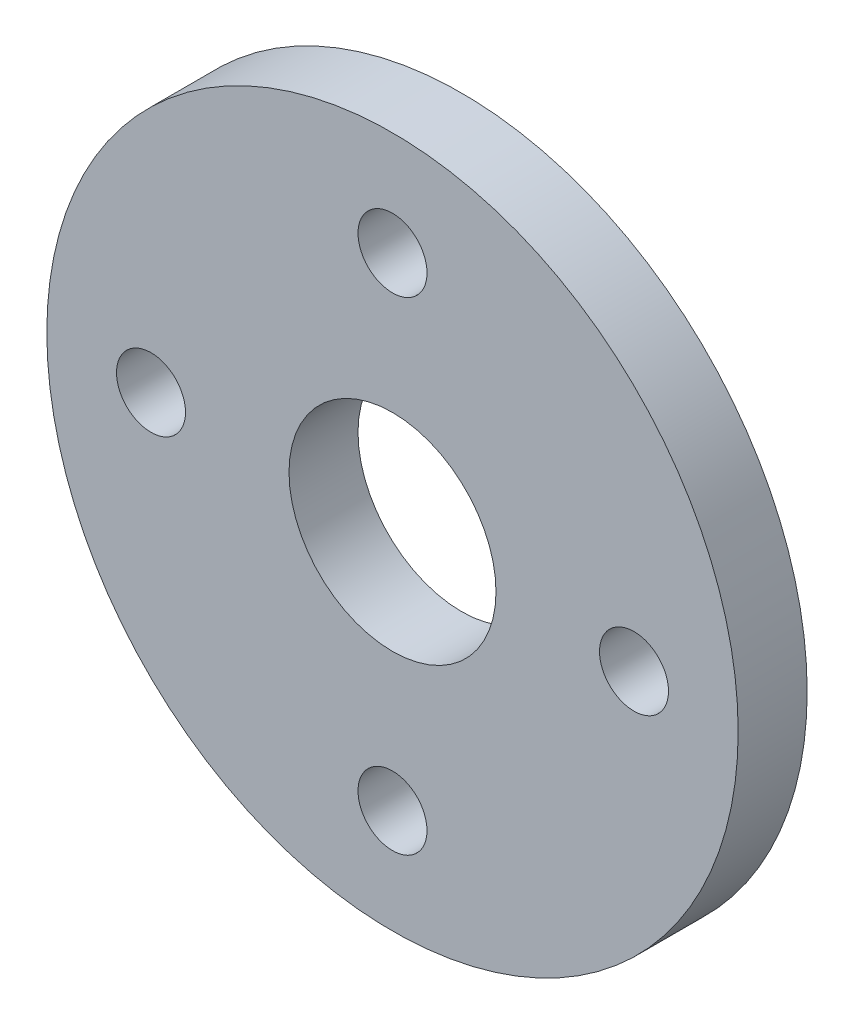
ISO-10303-21;
HEADER;
FILE_DESCRIPTION(('STEP AP214'),'2;1');
FILE_NAME('part.step','',(''),(''),'','','');
FILE_SCHEMA(('AUTOMOTIVE_DESIGN { 1 0 10303 214 1 1 1 1 }'));
ENDSEC;
DATA;
#1=APPLICATION_CONTEXT('core data for automotive mechanical design processes');
#2=APPLICATION_PROTOCOL_DEFINITION('international standard','automotive_design',2000,#1);
#3=PRODUCT_CONTEXT('',#1,'mechanical');
#4=PRODUCT('Part','Part','',(#3));
#5=PRODUCT_RELATED_PRODUCT_CATEGORY('part','',(#4));
#6=PRODUCT_DEFINITION_FORMATION('','',#4);
#7=PRODUCT_DEFINITION_CONTEXT('part definition',#1,'design');
#8=PRODUCT_DEFINITION('design','',#6,#7);
#9=PRODUCT_DEFINITION_SHAPE('','',#8);
#10=(LENGTH_UNIT() NAMED_UNIT(*) SI_UNIT(.MILLI.,.METRE.));
#11=(NAMED_UNIT(*) PLANE_ANGLE_UNIT() SI_UNIT($,.RADIAN.));
#12=(NAMED_UNIT(*) SI_UNIT($,.STERADIAN.) SOLID_ANGLE_UNIT());
#13=UNCERTAINTY_MEASURE_WITH_UNIT(LENGTH_MEASURE(1.E-05),#10,'distance_accuracy_value','');
#14=(GEOMETRIC_REPRESENTATION_CONTEXT(3) GLOBAL_UNCERTAINTY_ASSIGNED_CONTEXT((#13)) GLOBAL_UNIT_ASSIGNED_CONTEXT((#10,
#11,#12)) REPRESENTATION_CONTEXT('',''));
#15=CARTESIAN_POINT('',(0.,0.,0.));
#16=DIRECTION('',(0.,0.,1.));
#17=DIRECTION('',(1.,0.,0.));
#18=AXIS2_PLACEMENT_3D('',#15,#16,#17);
#19=CARTESIAN_POINT('',(0.,0.,2.));
#20=DIRECTION('',(0.,0.,1.));
#21=DIRECTION('',(1.,0.,0.));
#22=AXIS2_PLACEMENT_3D('',#19,#20,#21);
#23=PLANE('',#22);
#24=CARTESIAN_POINT('',(0.,-7.,2.));
#25=DIRECTION('',(0.,0.,1.));
#26=DIRECTION('',(1.,0.,0.));
#27=AXIS2_PLACEMENT_3D('',#24,#25,#26);
#28=CIRCLE('',#27,1.);
#29=CARTESIAN_POINT('',(0.999999999999951,-7.,2.));
#30=VERTEX_POINT('',#29);
#31=EDGE_CURVE('E65',#30,#30,#28,.T.);
#32=ORIENTED_EDGE('',*,*,#31,.F.);
#33=EDGE_LOOP('',(#32));
#34=FACE_BOUND('',#33,.T.);
#35=CARTESIAN_POINT('',(0.,7.,2.));
#36=DIRECTION('',(0.,0.,1.));
#37=DIRECTION('',(1.,0.,0.));
#38=AXIS2_PLACEMENT_3D('',#35,#36,#37);
#39=CIRCLE('',#38,1.);
#40=CARTESIAN_POINT('',(1.,7.,2.));
#41=VERTEX_POINT('',#40);
#42=EDGE_CURVE('E53',#41,#41,#39,.T.);
#43=ORIENTED_EDGE('',*,*,#42,.F.);
#44=EDGE_LOOP('',(#43));
#45=FACE_BOUND('',#44,.T.);
#46=CARTESIAN_POINT('',(0.,0.,2.));
#47=DIRECTION('',(0.,0.,1.));
#48=DIRECTION('',(1.,0.,0.));
#49=AXIS2_PLACEMENT_3D('',#46,#47,#48);
#50=CIRCLE('',#49,10.02);
#51=CARTESIAN_POINT('',(10.02,0.,2.));
#52=VERTEX_POINT('',#51);
#53=EDGE_CURVE('E10',#52,#52,#50,.T.);
#54=ORIENTED_EDGE('',*,*,#53,.T.);
#55=EDGE_LOOP('',(#54));
#56=FACE_BOUND('',#55,.T.);
#57=CARTESIAN_POINT('',(0.,0.,2.));
#58=DIRECTION('',(0.,0.,1.));
#59=DIRECTION('',(1.,0.,0.));
#60=AXIS2_PLACEMENT_3D('',#57,#58,#59);
#61=CIRCLE('',#60,3.);
#62=CARTESIAN_POINT('',(3.,0.,2.));
#63=VERTEX_POINT('',#62);
#64=EDGE_CURVE('E48',#63,#63,#61,.T.);
#65=ORIENTED_EDGE('',*,*,#64,.F.);
#66=EDGE_LOOP('',(#65));
#67=FACE_BOUND('',#66,.T.);
#68=CARTESIAN_POINT('',(7.,0.,2.));
#69=DIRECTION('',(0.,0.,1.));
#70=DIRECTION('',(1.,0.,0.));
#71=AXIS2_PLACEMENT_3D('',#68,#69,#70);
#72=CIRCLE('',#71,1.);
#73=CARTESIAN_POINT('',(8.,0.,2.));
#74=VERTEX_POINT('',#73);
#75=EDGE_CURVE('E59',#74,#74,#72,.T.);
#76=ORIENTED_EDGE('',*,*,#75,.F.);
#77=EDGE_LOOP('',(#76));
#78=FACE_BOUND('',#77,.T.);
#79=CARTESIAN_POINT('',(-7.,0.,2.));
#80=DIRECTION('',(0.,0.,1.));
#81=DIRECTION('',(1.,0.,0.));
#82=AXIS2_PLACEMENT_3D('',#79,#80,#81);
#83=CIRCLE('',#82,1.);
#84=CARTESIAN_POINT('',(-6.,0.,2.));
#85=VERTEX_POINT('',#84);
#86=EDGE_CURVE('E71',#85,#85,#83,.T.);
#87=ORIENTED_EDGE('',*,*,#86,.F.);
#88=EDGE_LOOP('',(#87));
#89=FACE_BOUND('',#88,.T.);
#90=ADVANCED_FACE('F37',(#34,#45,#56,#67,#78,#89),#23,.T.);
#91=CARTESIAN_POINT('',(0.,0.,0.));
#92=DIRECTION('',(0.,0.,1.));
#93=DIRECTION('',(1.,0.,0.));
#94=AXIS2_PLACEMENT_3D('',#91,#92,#93);
#95=PLANE('',#94);
#96=CARTESIAN_POINT('',(0.,0.,0.));
#97=DIRECTION('',(0.,0.,1.));
#98=DIRECTION('',(1.,0.,0.));
#99=AXIS2_PLACEMENT_3D('',#96,#97,#98);
#100=CIRCLE('',#99,10.02);
#101=CARTESIAN_POINT('',(10.02,0.,0.));
#102=VERTEX_POINT('',#101);
#103=EDGE_CURVE('E41',#102,#102,#100,.T.);
#104=ORIENTED_EDGE('',*,*,#103,.F.);
#105=EDGE_LOOP('',(#104));
#106=FACE_BOUND('',#105,.T.);
#107=CARTESIAN_POINT('',(0.,0.,0.));
#108=DIRECTION('',(0.,0.,1.));
#109=DIRECTION('',(1.,0.,0.));
#110=AXIS2_PLACEMENT_3D('',#107,#108,#109);
#111=CIRCLE('',#110,3.);
#112=CARTESIAN_POINT('',(3.,0.,0.));
#113=VERTEX_POINT('',#112);
#114=EDGE_CURVE('E50',#113,#113,#111,.T.);
#115=ORIENTED_EDGE('',*,*,#114,.T.);
#116=EDGE_LOOP('',(#115));
#117=FACE_BOUND('',#116,.T.);
#118=CARTESIAN_POINT('',(0.,7.,0.));
#119=DIRECTION('',(0.,0.,1.));
#120=DIRECTION('',(1.,0.,0.));
#121=AXIS2_PLACEMENT_3D('',#118,#119,#120);
#122=CIRCLE('',#121,1.);
#123=CARTESIAN_POINT('',(1.,7.,0.));
#124=VERTEX_POINT('',#123);
#125=EDGE_CURVE('E56',#124,#124,#122,.T.);
#126=ORIENTED_EDGE('',*,*,#125,.T.);
#127=EDGE_LOOP('',(#126));
#128=FACE_BOUND('',#127,.T.);
#129=CARTESIAN_POINT('',(7.,0.,0.));
#130=DIRECTION('',(0.,0.,1.));
#131=DIRECTION('',(1.,0.,0.));
#132=AXIS2_PLACEMENT_3D('',#129,#130,#131);
#133=CIRCLE('',#132,1.);
#134=CARTESIAN_POINT('',(8.,0.,0.));
#135=VERTEX_POINT('',#134);
#136=EDGE_CURVE('E62',#135,#135,#133,.T.);
#137=ORIENTED_EDGE('',*,*,#136,.T.);
#138=EDGE_LOOP('',(#137));
#139=FACE_BOUND('',#138,.T.);
#140=CARTESIAN_POINT('',(0.,-7.,0.));
#141=DIRECTION('',(0.,0.,1.));
#142=DIRECTION('',(1.,0.,0.));
#143=AXIS2_PLACEMENT_3D('',#140,#141,#142);
#144=CIRCLE('',#143,1.);
#145=CARTESIAN_POINT('',(0.999999999999951,-7.,0.));
#146=VERTEX_POINT('',#145);
#147=EDGE_CURVE('E68',#146,#146,#144,.T.);
#148=ORIENTED_EDGE('',*,*,#147,.T.);
#149=EDGE_LOOP('',(#148));
#150=FACE_BOUND('',#149,.T.);
#151=CARTESIAN_POINT('',(-7.,0.,0.));
#152=DIRECTION('',(0.,0.,1.));
#153=DIRECTION('',(1.,0.,0.));
#154=AXIS2_PLACEMENT_3D('',#151,#152,#153);
#155=CIRCLE('',#154,1.);
#156=CARTESIAN_POINT('',(-6.,0.,0.));
#157=VERTEX_POINT('',#156);
#158=EDGE_CURVE('E74',#157,#157,#155,.T.);
#159=ORIENTED_EDGE('',*,*,#158,.T.);
#160=EDGE_LOOP('',(#159));
#161=FACE_BOUND('',#160,.T.);
#162=ADVANCED_FACE('F84',(#106,#117,#128,#139,#150,#161),#95,.F.);
#163=CARTESIAN_POINT('',(0.,0.,2.));
#164=DIRECTION('',(0.,0.,-1.));
#165=DIRECTION('',(-1.,0.,0.));
#166=AXIS2_PLACEMENT_3D('',#163,#164,#165);
#167=CYLINDRICAL_SURFACE('',#166,10.02);
#168=ORIENTED_EDGE('',*,*,#53,.F.);
#169=EDGE_LOOP('',(#168));
#170=FACE_BOUND('',#169,.T.);
#171=ORIENTED_EDGE('',*,*,#103,.T.);
#172=EDGE_LOOP('',(#171));
#173=FACE_BOUND('',#172,.T.);
#174=ADVANCED_FACE('F39',(#170,#173),#167,.T.);
#175=CARTESIAN_POINT('',(0.,0.,2.));
#176=DIRECTION('',(0.,0.,-1.));
#177=DIRECTION('',(-1.,0.,0.));
#178=AXIS2_PLACEMENT_3D('',#175,#176,#177);
#179=CYLINDRICAL_SURFACE('',#178,3.);
#180=ORIENTED_EDGE('',*,*,#64,.T.);
#181=EDGE_LOOP('',(#180));
#182=FACE_BOUND('',#181,.T.);
#183=ORIENTED_EDGE('',*,*,#114,.F.);
#184=EDGE_LOOP('',(#183));
#185=FACE_BOUND('',#184,.T.);
#186=ADVANCED_FACE('F94',(#182,#185),#179,.F.);
#187=CARTESIAN_POINT('',(0.,7.,2.));
#188=DIRECTION('',(0.,0.,-1.));
#189=DIRECTION('',(-1.,0.,0.));
#190=AXIS2_PLACEMENT_3D('',#187,#188,#189);
#191=CYLINDRICAL_SURFACE('',#190,1.);
#192=ORIENTED_EDGE('',*,*,#42,.T.);
#193=EDGE_LOOP('',(#192));
#194=FACE_BOUND('',#193,.T.);
#195=ORIENTED_EDGE('',*,*,#125,.F.);
#196=EDGE_LOOP('',(#195));
#197=FACE_BOUND('',#196,.T.);
#198=ADVANCED_FACE('F97',(#194,#197),#191,.F.);
#199=CARTESIAN_POINT('',(7.,0.,2.));
#200=DIRECTION('',(0.,0.,-1.));
#201=DIRECTION('',(-1.,0.,0.));
#202=AXIS2_PLACEMENT_3D('',#199,#200,#201);
#203=CYLINDRICAL_SURFACE('',#202,1.);
#204=ORIENTED_EDGE('',*,*,#75,.T.);
#205=EDGE_LOOP('',(#204));
#206=FACE_BOUND('',#205,.T.);
#207=ORIENTED_EDGE('',*,*,#136,.F.);
#208=EDGE_LOOP('',(#207));
#209=FACE_BOUND('',#208,.T.);
#210=ADVANCED_FACE('F101',(#206,#209),#203,.F.);
#211=CARTESIAN_POINT('',(0.,-7.,2.));
#212=DIRECTION('',(0.,0.,-1.));
#213=DIRECTION('',(-1.,0.,0.));
#214=AXIS2_PLACEMENT_3D('',#211,#212,#213);
#215=CYLINDRICAL_SURFACE('',#214,1.);
#216=ORIENTED_EDGE('',*,*,#31,.T.);
#217=EDGE_LOOP('',(#216));
#218=FACE_BOUND('',#217,.T.);
#219=ORIENTED_EDGE('',*,*,#147,.F.);
#220=EDGE_LOOP('',(#219));
#221=FACE_BOUND('',#220,.T.);
#222=ADVANCED_FACE('F105',(#218,#221),#215,.F.);
#223=CARTESIAN_POINT('',(-7.,0.,2.));
#224=DIRECTION('',(0.,0.,-1.));
#225=DIRECTION('',(-1.,0.,0.));
#226=AXIS2_PLACEMENT_3D('',#223,#224,#225);
#227=CYLINDRICAL_SURFACE('',#226,1.);
#228=ORIENTED_EDGE('',*,*,#86,.T.);
#229=EDGE_LOOP('',(#228));
#230=FACE_BOUND('',#229,.T.);
#231=ORIENTED_EDGE('',*,*,#158,.F.);
#232=EDGE_LOOP('',(#231));
#233=FACE_BOUND('',#232,.T.);
#234=ADVANCED_FACE('F80',(#230,#233),#227,.F.);
#235=CLOSED_SHELL('',(#90,#162,#174,#186,#198,#210,#222,#234));
#236=MANIFOLD_SOLID_BREP('B2',#235);
#237=ADVANCED_BREP_SHAPE_REPRESENTATION('',(#18,#236),#14);
#238=SHAPE_DEFINITION_REPRESENTATION(#9,#237);
ENDSEC;
END-ISO-10303-21;
